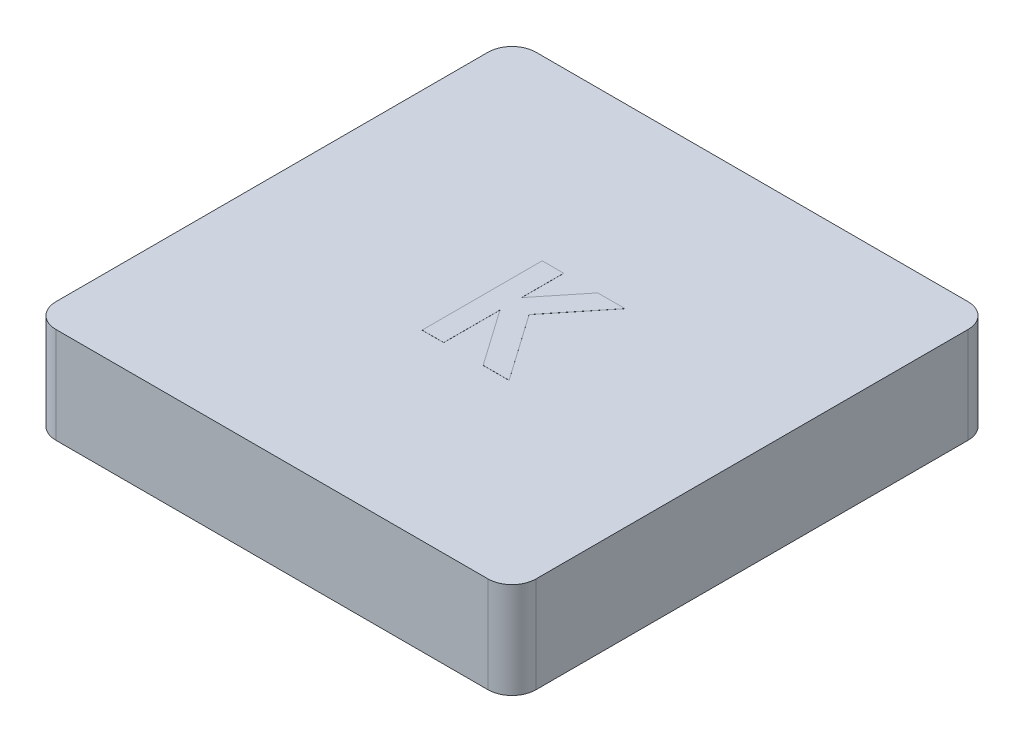
ISO-10303-21;
HEADER;
FILE_DESCRIPTION(('STEP AP214'),'2;1');
FILE_NAME('part.step','',(''),(''),'','','');
FILE_SCHEMA(('AUTOMOTIVE_DESIGN { 1 0 10303 214 1 1 1 1 }'));
ENDSEC;
DATA;
#1=APPLICATION_CONTEXT('core data for automotive mechanical design processes');
#2=APPLICATION_PROTOCOL_DEFINITION('international standard','automotive_design',2000,#1);
#3=PRODUCT_CONTEXT('',#1,'mechanical');
#4=PRODUCT('Part','Part','',(#3));
#5=PRODUCT_RELATED_PRODUCT_CATEGORY('part','',(#4));
#6=PRODUCT_DEFINITION_FORMATION('','',#4);
#7=PRODUCT_DEFINITION_CONTEXT('part definition',#1,'design');
#8=PRODUCT_DEFINITION('design','',#6,#7);
#9=PRODUCT_DEFINITION_SHAPE('','',#8);
#10=(LENGTH_UNIT() NAMED_UNIT(*) SI_UNIT(.MILLI.,.METRE.));
#11=(NAMED_UNIT(*) PLANE_ANGLE_UNIT() SI_UNIT($,.RADIAN.));
#12=(NAMED_UNIT(*) SI_UNIT($,.STERADIAN.) SOLID_ANGLE_UNIT());
#13=UNCERTAINTY_MEASURE_WITH_UNIT(LENGTH_MEASURE(1.E-05),#10,'distance_accuracy_value','');
#14=(GEOMETRIC_REPRESENTATION_CONTEXT(3) GLOBAL_UNCERTAINTY_ASSIGNED_CONTEXT((#13)) GLOBAL_UNIT_ASSIGNED_CONTEXT((#10,
#11,#12)) REPRESENTATION_CONTEXT('',''));
#15=CARTESIAN_POINT('',(0.,0.,0.));
#16=DIRECTION('',(0.,0.,1.));
#17=DIRECTION('',(1.,0.,0.));
#18=AXIS2_PLACEMENT_3D('',#15,#16,#17);
#19=CARTESIAN_POINT('',(0.,2.54,-12.7));
#20=DIRECTION('',(1.,0.,0.));
#21=DIRECTION('',(0.,0.,-1.));
#22=AXIS2_PLACEMENT_3D('',#19,#20,#21);
#23=PLANE('',#22);
#24=DIRECTION('',(0.,0.,1.));
#25=VECTOR('',#24,1.);
#26=CARTESIAN_POINT('',(0.,2.54,-12.7));
#27=LINE('',#26,#25);
#28=CARTESIAN_POINT('',(0.,2.54,-12.065));
#29=VERTEX_POINT('',#28);
#30=CARTESIAN_POINT('',(0.,2.54,-0.635));
#31=VERTEX_POINT('',#30);
#32=EDGE_CURVE('E322',#29,#31,#27,.T.);
#33=ORIENTED_EDGE('',*,*,#32,.F.);
#34=DIRECTION('',(0.,-1.,0.));
#35=VECTOR('',#34,1.);
#36=CARTESIAN_POINT('',(0.,2.54,-12.065));
#37=LINE('',#36,#35);
#38=CARTESIAN_POINT('',(0.,0.,-12.065));
#39=VERTEX_POINT('',#38);
#40=EDGE_CURVE('E347',#29,#39,#37,.T.);
#41=ORIENTED_EDGE('',*,*,#40,.T.);
#42=DIRECTION('',(0.,0.,1.));
#43=VECTOR('',#42,1.);
#44=CARTESIAN_POINT('',(0.,0.,-12.7));
#45=LINE('',#44,#43);
#46=CARTESIAN_POINT('',(0.,0.,-0.635));
#47=VERTEX_POINT('',#46);
#48=EDGE_CURVE('E302',#39,#47,#45,.T.);
#49=ORIENTED_EDGE('',*,*,#48,.T.);
#50=DIRECTION('',(0.,-1.,0.));
#51=VECTOR('',#50,1.);
#52=CARTESIAN_POINT('',(0.,2.54,-0.635));
#53=LINE('',#52,#51);
#54=EDGE_CURVE('E335',#47,#31,#53,.F.);
#55=ORIENTED_EDGE('',*,*,#54,.T.);
#56=EDGE_LOOP('',(#33,#41,#49,#55));
#57=FACE_BOUND('',#56,.T.);
#58=ADVANCED_FACE('F33',(#57),#23,.F.);
#59=CARTESIAN_POINT('',(0.,2.54,0.));
#60=DIRECTION('',(0.,0.,-1.));
#61=DIRECTION('',(-1.,0.,0.));
#62=AXIS2_PLACEMENT_3D('',#59,#60,#61);
#63=PLANE('',#62);
#64=DIRECTION('',(1.,0.,0.));
#65=VECTOR('',#64,1.);
#66=CARTESIAN_POINT('',(0.,0.,0.));
#67=LINE('',#66,#65);
#68=CARTESIAN_POINT('',(0.635,0.,0.));
#69=VERTEX_POINT('',#68);
#70=CARTESIAN_POINT('',(12.065,0.,0.));
#71=VERTEX_POINT('',#70);
#72=EDGE_CURVE('E338',#69,#71,#67,.T.);
#73=ORIENTED_EDGE('',*,*,#72,.T.);
#74=DIRECTION('',(0.,-1.,0.));
#75=VECTOR('',#74,1.);
#76=CARTESIAN_POINT('',(12.065,2.54,0.));
#77=LINE('',#76,#75);
#78=CARTESIAN_POINT('',(12.065,2.54,0.));
#79=VERTEX_POINT('',#78);
#80=EDGE_CURVE('E41',#71,#79,#77,.F.);
#81=ORIENTED_EDGE('',*,*,#80,.T.);
#82=DIRECTION('',(1.,0.,0.));
#83=VECTOR('',#82,1.);
#84=CARTESIAN_POINT('',(0.,2.54,0.));
#85=LINE('',#84,#83);
#86=CARTESIAN_POINT('',(0.635,2.54,0.));
#87=VERTEX_POINT('',#86);
#88=EDGE_CURVE('E325',#87,#79,#85,.T.);
#89=ORIENTED_EDGE('',*,*,#88,.F.);
#90=DIRECTION('',(0.,-1.,0.));
#91=VECTOR('',#90,1.);
#92=CARTESIAN_POINT('',(0.635,2.54,0.));
#93=LINE('',#92,#91);
#94=EDGE_CURVE('E376',#87,#69,#93,.T.);
#95=ORIENTED_EDGE('',*,*,#94,.T.);
#96=EDGE_LOOP('',(#73,#81,#89,#95));
#97=FACE_BOUND('',#96,.T.);
#98=ADVANCED_FACE('F381',(#97),#63,.F.);
#99=CARTESIAN_POINT('',(12.7,2.54,0.));
#100=DIRECTION('',(-1.,0.,0.));
#101=DIRECTION('',(0.,0.,1.));
#102=AXIS2_PLACEMENT_3D('',#99,#100,#101);
#103=PLANE('',#102);
#104=DIRECTION('',(0.,0.,-1.));
#105=VECTOR('',#104,1.);
#106=CARTESIAN_POINT('',(12.7,0.,0.));
#107=LINE('',#106,#105);
#108=CARTESIAN_POINT('',(12.7,0.,-0.635));
#109=VERTEX_POINT('',#108);
#110=CARTESIAN_POINT('',(12.7,0.,-12.065));
#111=VERTEX_POINT('',#110);
#112=EDGE_CURVE('E341',#109,#111,#107,.T.);
#113=ORIENTED_EDGE('',*,*,#112,.T.);
#114=DIRECTION('',(0.,-1.,0.));
#115=VECTOR('',#114,1.);
#116=CARTESIAN_POINT('',(12.7,2.54,-12.065));
#117=LINE('',#116,#115);
#118=CARTESIAN_POINT('',(12.7,2.54,-12.065));
#119=VERTEX_POINT('',#118);
#120=EDGE_CURVE('E374',#111,#119,#117,.F.);
#121=ORIENTED_EDGE('',*,*,#120,.T.);
#122=DIRECTION('',(0.,0.,-1.));
#123=VECTOR('',#122,1.);
#124=CARTESIAN_POINT('',(12.7,2.54,0.));
#125=LINE('',#124,#123);
#126=CARTESIAN_POINT('',(12.7,2.54,-0.635));
#127=VERTEX_POINT('',#126);
#128=EDGE_CURVE('E329',#127,#119,#125,.T.);
#129=ORIENTED_EDGE('',*,*,#128,.F.);
#130=DIRECTION('',(0.,-1.,0.));
#131=VECTOR('',#130,1.);
#132=CARTESIAN_POINT('',(12.7,2.54,-0.635));
#133=LINE('',#132,#131);
#134=EDGE_CURVE('E371',#127,#109,#133,.T.);
#135=ORIENTED_EDGE('',*,*,#134,.T.);
#136=EDGE_LOOP('',(#113,#121,#129,#135));
#137=FACE_BOUND('',#136,.T.);
#138=ADVANCED_FACE('F394',(#137),#103,.F.);
#139=CARTESIAN_POINT('',(12.7,2.54,-12.7));
#140=DIRECTION('',(0.,0.,1.));
#141=DIRECTION('',(1.,0.,0.));
#142=AXIS2_PLACEMENT_3D('',#139,#140,#141);
#143=PLANE('',#142);
#144=DIRECTION('',(-1.,0.,0.));
#145=VECTOR('',#144,1.);
#146=CARTESIAN_POINT('',(12.7,0.,-12.7));
#147=LINE('',#146,#145);
#148=CARTESIAN_POINT('',(12.065,0.,-12.7));
#149=VERTEX_POINT('',#148);
#150=CARTESIAN_POINT('',(0.634999999999995,0.,-12.7));
#151=VERTEX_POINT('',#150);
#152=EDGE_CURVE('E326',#149,#151,#147,.T.);
#153=ORIENTED_EDGE('',*,*,#152,.T.);
#154=DIRECTION('',(0.,-1.,0.));
#155=VECTOR('',#154,1.);
#156=CARTESIAN_POINT('',(0.634999999999995,2.54,-12.7));
#157=LINE('',#156,#155);
#158=CARTESIAN_POINT('',(0.634999999999995,2.54,-12.7));
#159=VERTEX_POINT('',#158);
#160=EDGE_CURVE('E361',#151,#159,#157,.F.);
#161=ORIENTED_EDGE('',*,*,#160,.T.);
#162=DIRECTION('',(-1.,0.,0.));
#163=VECTOR('',#162,1.);
#164=CARTESIAN_POINT('',(12.7,2.54,-12.7));
#165=LINE('',#164,#163);
#166=CARTESIAN_POINT('',(12.065,2.54,-12.7));
#167=VERTEX_POINT('',#166);
#168=EDGE_CURVE('E332',#167,#159,#165,.T.);
#169=ORIENTED_EDGE('',*,*,#168,.F.);
#170=DIRECTION('',(0.,-1.,0.));
#171=VECTOR('',#170,1.);
#172=CARTESIAN_POINT('',(12.065,2.54,-12.7));
#173=LINE('',#172,#171);
#174=EDGE_CURVE('E358',#167,#149,#173,.T.);
#175=ORIENTED_EDGE('',*,*,#174,.T.);
#176=EDGE_LOOP('',(#153,#161,#169,#175));
#177=FACE_BOUND('',#176,.T.);
#178=ADVANCED_FACE('F406',(#177),#143,.F.);
#179=CARTESIAN_POINT('',(0.,2.54,0.));
#180=DIRECTION('',(0.,1.,0.));
#181=DIRECTION('',(0.,0.,1.));
#182=AXIS2_PLACEMENT_3D('',#179,#180,#181);
#183=PLANE('',#182);
#184=DIRECTION('',(0.,0.,-1.));
#185=VECTOR('',#184,1.);
#186=CARTESIAN_POINT('',(5.49714615384615,2.54,-4.826));
#187=LINE('',#186,#185);
#188=CARTESIAN_POINT('',(5.49714615384615,2.54,-4.826));
#189=VERTEX_POINT('',#188);
#190=CARTESIAN_POINT('',(5.49714615384615,2.54,-8.001));
#191=VERTEX_POINT('',#190);
#192=EDGE_CURVE('E239',#189,#191,#187,.T.);
#193=ORIENTED_EDGE('',*,*,#192,.T.);
#194=DIRECTION('',(1.,0.,0.));
#195=VECTOR('',#194,1.);
#196=CARTESIAN_POINT('',(5.49714615384615,2.54,-8.001));
#197=LINE('',#196,#195);
#198=CARTESIAN_POINT('',(6.06701794871794,2.54,-8.001));
#199=VERTEX_POINT('',#198);
#200=EDGE_CURVE('E193',#191,#199,#197,.T.);
#201=ORIENTED_EDGE('',*,*,#200,.T.);
#202=DIRECTION('',(0.,0.,1.));
#203=VECTOR('',#202,1.);
#204=CARTESIAN_POINT('',(6.06701794871794,2.54,-8.001));
#205=LINE('',#204,#203);
#206=CARTESIAN_POINT('',(6.06701794871794,2.54,-6.88351702724359));
#207=VERTEX_POINT('',#206);
#208=EDGE_CURVE('E242',#199,#207,#205,.T.);
#209=ORIENTED_EDGE('',*,*,#208,.T.);
#210=DIRECTION('',(0.627501225330358,0.,-0.778615574085761));
#211=VECTOR('',#210,1.);
#212=CARTESIAN_POINT('',(6.06701794871794,2.54,-6.88351702724359));
#213=LINE('',#212,#211);
#214=CARTESIAN_POINT('',(6.9676189102564,2.54,-8.001));
#215=VERTEX_POINT('',#214);
#216=EDGE_CURVE('E244',#207,#215,#213,.T.);
#217=ORIENTED_EDGE('',*,*,#216,.T.);
#218=DIRECTION('',(1.,0.,0.));
#219=VECTOR('',#218,1.);
#220=CARTESIAN_POINT('',(6.96761891025641,2.54,-8.001));
#221=LINE('',#220,#219);
#222=CARTESIAN_POINT('',(7.68695484775641,2.54,-8.001));
#223=VERTEX_POINT('',#222);
#224=EDGE_CURVE('E246',#215,#223,#221,.T.);
#225=ORIENTED_EDGE('',*,*,#224,.T.);
#226=DIRECTION('',(-0.627400828485831,0.,0.778696475152734));
#227=VECTOR('',#226,1.);
#228=CARTESIAN_POINT('',(7.68695484775641,2.54,-8.001));
#229=LINE('',#228,#227);
#230=CARTESIAN_POINT('',(6.55547948717948,2.54,-6.59667307692308));
#231=VERTEX_POINT('',#230);
#232=EDGE_CURVE('E248',#223,#231,#229,.T.);
#233=ORIENTED_EDGE('',*,*,#232,.T.);
#234=DIRECTION('',(0.574093809748457,0.,0.818789531936323));
#235=VECTOR('',#234,1.);
#236=CARTESIAN_POINT('',(6.55547948717948,2.54,-6.59667307692308));
#237=LINE('',#236,#235);
#238=CARTESIAN_POINT('',(7.79698589743589,2.54,-4.826));
#239=VERTEX_POINT('',#238);
#240=EDGE_CURVE('E250',#231,#239,#237,.T.);
#241=ORIENTED_EDGE('',*,*,#240,.T.);
#242=DIRECTION('',(-1.,0.,0.));
#243=VECTOR('',#242,1.);
#244=CARTESIAN_POINT('',(7.79698589743589,2.54,-4.826));
#245=LINE('',#244,#243);
#246=CARTESIAN_POINT('',(7.11072287660256,2.54,-4.826));
#247=VERTEX_POINT('',#246);
#248=EDGE_CURVE('E252',#239,#247,#245,.T.);
#249=ORIENTED_EDGE('',*,*,#248,.T.);
#250=DIRECTION('',(-0.574002161068284,0.,-0.818853783705577));
#251=VECTOR('',#250,1.);
#252=CARTESIAN_POINT('',(7.11072287660256,2.54,-4.826));
#253=LINE('',#252,#251);
#254=CARTESIAN_POINT('',(6.06701794871794,2.54,-6.31491726762821));
#255=VERTEX_POINT('',#254);
#256=EDGE_CURVE('E254',#247,#255,#253,.T.);
#257=ORIENTED_EDGE('',*,*,#256,.T.);
#258=DIRECTION('',(0.,0.,1.));
#259=VECTOR('',#258,1.);
#260=CARTESIAN_POINT('',(6.06701794871794,2.54,-6.31491726762821));
#261=LINE('',#260,#259);
#262=CARTESIAN_POINT('',(6.06701794871794,2.54,-4.826));
#263=VERTEX_POINT('',#262);
#264=EDGE_CURVE('E53',#255,#263,#261,.T.);
#265=ORIENTED_EDGE('',*,*,#264,.T.);
#266=DIRECTION('',(-1.,0.,0.));
#267=VECTOR('',#266,1.);
#268=CARTESIAN_POINT('',(6.06701794871794,2.54,-4.826));
#269=LINE('',#268,#267);
#270=EDGE_CURVE('E48',#263,#189,#269,.T.);
#271=ORIENTED_EDGE('',*,*,#270,.T.);
#272=EDGE_LOOP('',(#193,#201,#209,#217,#225,#233,#241,#249,#257,#265,#271));
#273=FACE_BOUND('',#272,.T.);
#274=ORIENTED_EDGE('',*,*,#168,.T.);
#275=CARTESIAN_POINT('',(0.634999999999995,2.54,-12.065));
#276=DIRECTION('',(0.,1.,0.));
#277=DIRECTION('',(0.,0.,1.));
#278=AXIS2_PLACEMENT_3D('',#275,#276,#277);
#279=CIRCLE('',#278,0.635);
#280=EDGE_CURVE('E369',#159,#29,#279,.T.);
#281=ORIENTED_EDGE('',*,*,#280,.T.);
#282=ORIENTED_EDGE('',*,*,#32,.T.);
#283=CARTESIAN_POINT('',(0.635,2.54,-0.635));
#284=DIRECTION('',(0.,1.,0.));
#285=DIRECTION('',(0.,0.,1.));
#286=AXIS2_PLACEMENT_3D('',#283,#284,#285);
#287=CIRCLE('',#286,0.635);
#288=EDGE_CURVE('E363',#31,#87,#287,.T.);
#289=ORIENTED_EDGE('',*,*,#288,.T.);
#290=ORIENTED_EDGE('',*,*,#88,.T.);
#291=CARTESIAN_POINT('',(12.065,2.54,-0.635));
#292=DIRECTION('',(0.,1.,0.));
#293=DIRECTION('',(0.,0.,1.));
#294=AXIS2_PLACEMENT_3D('',#291,#292,#293);
#295=CIRCLE('',#294,0.635);
#296=EDGE_CURVE('E365',#79,#127,#295,.T.);
#297=ORIENTED_EDGE('',*,*,#296,.T.);
#298=ORIENTED_EDGE('',*,*,#128,.T.);
#299=CARTESIAN_POINT('',(12.065,2.54,-12.065));
#300=DIRECTION('',(0.,1.,0.));
#301=DIRECTION('',(0.,0.,1.));
#302=AXIS2_PLACEMENT_3D('',#299,#300,#301);
#303=CIRCLE('',#302,0.635);
#304=EDGE_CURVE('E367',#119,#167,#303,.T.);
#305=ORIENTED_EDGE('',*,*,#304,.T.);
#306=EDGE_LOOP('',(#274,#281,#282,#289,#290,#297,#298,#305));
#307=FACE_BOUND('',#306,.T.);
#308=ADVANCED_FACE('F387',(#273,#307),#183,.T.);
#309=CARTESIAN_POINT('',(0.,0.,0.));
#310=DIRECTION('',(0.,1.,0.));
#311=DIRECTION('',(0.,0.,1.));
#312=AXIS2_PLACEMENT_3D('',#309,#310,#311);
#313=PLANE('',#312);
#314=DIRECTION('',(-1.,0.,0.));
#315=VECTOR('',#314,1.);
#316=CARTESIAN_POINT('',(12.7,0.,-12.065));
#317=LINE('',#316,#315);
#318=CARTESIAN_POINT('',(12.065,0.,-12.065));
#319=VERTEX_POINT('',#318);
#320=CARTESIAN_POINT('',(0.634999999999995,0.,-12.065));
#321=VERTEX_POINT('',#320);
#322=EDGE_CURVE('E290',#319,#321,#317,.T.);
#323=ORIENTED_EDGE('',*,*,#322,.T.);
#324=DIRECTION('',(0.,0.,1.));
#325=VECTOR('',#324,1.);
#326=CARTESIAN_POINT('',(0.634999999999995,0.,-12.7));
#327=LINE('',#326,#325);
#328=CARTESIAN_POINT('',(0.635,0.,-0.635));
#329=VERTEX_POINT('',#328);
#330=EDGE_CURVE('E285',#321,#329,#327,.T.);
#331=ORIENTED_EDGE('',*,*,#330,.T.);
#332=DIRECTION('',(1.,0.,0.));
#333=VECTOR('',#332,1.);
#334=CARTESIAN_POINT('',(0.,0.,-0.635));
#335=LINE('',#334,#333);
#336=CARTESIAN_POINT('',(12.065,0.,-0.635));
#337=VERTEX_POINT('',#336);
#338=EDGE_CURVE('E314',#329,#337,#335,.T.);
#339=ORIENTED_EDGE('',*,*,#338,.T.);
#340=DIRECTION('',(0.,0.,-1.));
#341=VECTOR('',#340,1.);
#342=CARTESIAN_POINT('',(12.065,0.,0.));
#343=LINE('',#342,#341);
#344=EDGE_CURVE('E317',#337,#319,#343,.T.);
#345=ORIENTED_EDGE('',*,*,#344,.T.);
#346=EDGE_LOOP('',(#323,#331,#339,#345));
#347=FACE_BOUND('',#346,.T.);
#348=ORIENTED_EDGE('',*,*,#48,.F.);
#349=CARTESIAN_POINT('',(0.634999999999995,0.,-12.065));
#350=DIRECTION('',(0.,1.,0.));
#351=DIRECTION('',(0.,0.,1.));
#352=AXIS2_PLACEMENT_3D('',#349,#350,#351);
#353=CIRCLE('',#352,0.635);
#354=EDGE_CURVE('E356',#39,#151,#353,.F.);
#355=ORIENTED_EDGE('',*,*,#354,.T.);
#356=ORIENTED_EDGE('',*,*,#152,.F.);
#357=CARTESIAN_POINT('',(12.065,0.,-12.065));
#358=DIRECTION('',(0.,1.,0.));
#359=DIRECTION('',(0.,0.,1.));
#360=AXIS2_PLACEMENT_3D('',#357,#358,#359);
#361=CIRCLE('',#360,0.635);
#362=EDGE_CURVE('E354',#149,#111,#361,.F.);
#363=ORIENTED_EDGE('',*,*,#362,.T.);
#364=ORIENTED_EDGE('',*,*,#112,.F.);
#365=CARTESIAN_POINT('',(12.065,0.,-0.635));
#366=DIRECTION('',(0.,1.,0.));
#367=DIRECTION('',(0.,0.,1.));
#368=AXIS2_PLACEMENT_3D('',#365,#366,#367);
#369=CIRCLE('',#368,0.635);
#370=EDGE_CURVE('E352',#109,#71,#369,.F.);
#371=ORIENTED_EDGE('',*,*,#370,.T.);
#372=ORIENTED_EDGE('',*,*,#72,.F.);
#373=CARTESIAN_POINT('',(0.635,0.,-0.635));
#374=DIRECTION('',(0.,1.,0.));
#375=DIRECTION('',(0.,0.,1.));
#376=AXIS2_PLACEMENT_3D('',#373,#374,#375);
#377=CIRCLE('',#376,0.635);
#378=EDGE_CURVE('E350',#69,#47,#377,.F.);
#379=ORIENTED_EDGE('',*,*,#378,.T.);
#380=EDGE_LOOP('',(#348,#355,#356,#363,#364,#371,#372,#379));
#381=FACE_BOUND('',#380,.T.);
#382=ADVANCED_FACE('F398',(#347,#381),#313,.F.);
#383=CARTESIAN_POINT('',(0.634999999999995,2.54,-12.065));
#384=DIRECTION('',(0.,-1.,0.));
#385=DIRECTION('',(0.,0.,-1.));
#386=AXIS2_PLACEMENT_3D('',#383,#384,#385);
#387=CYLINDRICAL_SURFACE('',#386,0.635);
#388=ORIENTED_EDGE('',*,*,#280,.F.);
#389=ORIENTED_EDGE('',*,*,#160,.F.);
#390=ORIENTED_EDGE('',*,*,#354,.F.);
#391=ORIENTED_EDGE('',*,*,#40,.F.);
#392=EDGE_LOOP('',(#388,#389,#390,#391));
#393=FACE_BOUND('',#392,.T.);
#394=ADVANCED_FACE('F412',(#393),#387,.T.);
#395=CARTESIAN_POINT('',(12.065,2.54,-12.065));
#396=DIRECTION('',(0.,-1.,0.));
#397=DIRECTION('',(0.,0.,-1.));
#398=AXIS2_PLACEMENT_3D('',#395,#396,#397);
#399=CYLINDRICAL_SURFACE('',#398,0.635);
#400=ORIENTED_EDGE('',*,*,#304,.F.);
#401=ORIENTED_EDGE('',*,*,#120,.F.);
#402=ORIENTED_EDGE('',*,*,#362,.F.);
#403=ORIENTED_EDGE('',*,*,#174,.F.);
#404=EDGE_LOOP('',(#400,#401,#402,#403));
#405=FACE_BOUND('',#404,.T.);
#406=ADVANCED_FACE('F403',(#405),#399,.T.);
#407=CARTESIAN_POINT('',(12.065,2.54,-0.635));
#408=DIRECTION('',(0.,-1.,0.));
#409=DIRECTION('',(0.,0.,-1.));
#410=AXIS2_PLACEMENT_3D('',#407,#408,#409);
#411=CYLINDRICAL_SURFACE('',#410,0.635);
#412=ORIENTED_EDGE('',*,*,#296,.F.);
#413=ORIENTED_EDGE('',*,*,#80,.F.);
#414=ORIENTED_EDGE('',*,*,#370,.F.);
#415=ORIENTED_EDGE('',*,*,#134,.F.);
#416=EDGE_LOOP('',(#412,#413,#414,#415));
#417=FACE_BOUND('',#416,.T.);
#418=ADVANCED_FACE('F391',(#417),#411,.T.);
#419=CARTESIAN_POINT('',(0.635,2.54,-0.635));
#420=DIRECTION('',(0.,-1.,0.));
#421=DIRECTION('',(0.,0.,-1.));
#422=AXIS2_PLACEMENT_3D('',#419,#420,#421);
#423=CYLINDRICAL_SURFACE('',#422,0.635);
#424=ORIENTED_EDGE('',*,*,#288,.F.);
#425=ORIENTED_EDGE('',*,*,#54,.F.);
#426=ORIENTED_EDGE('',*,*,#378,.F.);
#427=ORIENTED_EDGE('',*,*,#94,.F.);
#428=EDGE_LOOP('',(#424,#425,#426,#427));
#429=FACE_BOUND('',#428,.T.);
#430=ADVANCED_FACE('F35',(#429),#423,.T.);
#431=CARTESIAN_POINT('',(0.634999999999995,2.54,-12.7));
#432=DIRECTION('',(1.,0.,0.));
#433=DIRECTION('',(0.,0.,-1.));
#434=AXIS2_PLACEMENT_3D('',#431,#432,#433);
#435=PLANE('',#434);
#436=DIRECTION('',(0.,0.,1.));
#437=VECTOR('',#436,1.);
#438=CARTESIAN_POINT('',(0.634999999999995,1.905,-12.7));
#439=LINE('',#438,#437);
#440=CARTESIAN_POINT('',(0.634999999999995,1.905,-12.065));
#441=VERTEX_POINT('',#440);
#442=CARTESIAN_POINT('',(0.635,1.905,-0.635));
#443=VERTEX_POINT('',#442);
#444=EDGE_CURVE('E286',#441,#443,#439,.T.);
#445=ORIENTED_EDGE('',*,*,#444,.T.);
#446=DIRECTION('',(0.,1.,0.));
#447=VECTOR('',#446,1.);
#448=CARTESIAN_POINT('',(0.635,2.54,-0.635));
#449=LINE('',#448,#447);
#450=EDGE_CURVE('E295',#329,#443,#449,.T.);
#451=ORIENTED_EDGE('',*,*,#450,.F.);
#452=ORIENTED_EDGE('',*,*,#330,.F.);
#453=DIRECTION('',(0.,1.,0.));
#454=VECTOR('',#453,1.);
#455=CARTESIAN_POINT('',(0.634999999999995,2.54,-12.065));
#456=LINE('',#455,#454);
#457=EDGE_CURVE('E291',#321,#441,#456,.T.);
#458=ORIENTED_EDGE('',*,*,#457,.T.);
#459=EDGE_LOOP('',(#445,#451,#452,#458));
#460=FACE_BOUND('',#459,.T.);
#461=ADVANCED_FACE('F417',(#460),#435,.T.);
#462=CARTESIAN_POINT('',(0.,2.54,-0.635));
#463=DIRECTION('',(0.,0.,-1.));
#464=DIRECTION('',(-1.,0.,0.));
#465=AXIS2_PLACEMENT_3D('',#462,#463,#464);
#466=PLANE('',#465);
#467=ORIENTED_EDGE('',*,*,#338,.F.);
#468=ORIENTED_EDGE('',*,*,#450,.T.);
#469=DIRECTION('',(1.,0.,0.));
#470=VECTOR('',#469,1.);
#471=CARTESIAN_POINT('',(0.,1.905,-0.635));
#472=LINE('',#471,#470);
#473=CARTESIAN_POINT('',(12.065,1.905,-0.635));
#474=VERTEX_POINT('',#473);
#475=EDGE_CURVE('E289',#443,#474,#472,.T.);
#476=ORIENTED_EDGE('',*,*,#475,.T.);
#477=DIRECTION('',(0.,1.,0.));
#478=VECTOR('',#477,1.);
#479=CARTESIAN_POINT('',(12.065,2.54,-0.635));
#480=LINE('',#479,#478);
#481=EDGE_CURVE('E299',#337,#474,#480,.T.);
#482=ORIENTED_EDGE('',*,*,#481,.F.);
#483=EDGE_LOOP('',(#467,#468,#476,#482));
#484=FACE_BOUND('',#483,.T.);
#485=ADVANCED_FACE('F422',(#484),#466,.T.);
#486=CARTESIAN_POINT('',(12.065,2.54,0.));
#487=DIRECTION('',(-1.,0.,0.));
#488=DIRECTION('',(0.,0.,1.));
#489=AXIS2_PLACEMENT_3D('',#486,#487,#488);
#490=PLANE('',#489);
#491=ORIENTED_EDGE('',*,*,#344,.F.);
#492=ORIENTED_EDGE('',*,*,#481,.T.);
#493=DIRECTION('',(0.,0.,-1.));
#494=VECTOR('',#493,1.);
#495=CARTESIAN_POINT('',(12.065,1.905,0.));
#496=LINE('',#495,#494);
#497=CARTESIAN_POINT('',(12.065,1.905,-12.065));
#498=VERTEX_POINT('',#497);
#499=EDGE_CURVE('E305',#474,#498,#496,.T.);
#500=ORIENTED_EDGE('',*,*,#499,.T.);
#501=DIRECTION('',(0.,1.,0.));
#502=VECTOR('',#501,1.);
#503=CARTESIAN_POINT('',(12.065,2.54,-12.065));
#504=LINE('',#503,#502);
#505=EDGE_CURVE('E294',#319,#498,#504,.T.);
#506=ORIENTED_EDGE('',*,*,#505,.F.);
#507=EDGE_LOOP('',(#491,#492,#500,#506));
#508=FACE_BOUND('',#507,.T.);
#509=ADVANCED_FACE('F475',(#508),#490,.T.);
#510=CARTESIAN_POINT('',(12.7,2.54,-12.065));
#511=DIRECTION('',(0.,0.,1.));
#512=DIRECTION('',(1.,0.,0.));
#513=AXIS2_PLACEMENT_3D('',#510,#511,#512);
#514=PLANE('',#513);
#515=ORIENTED_EDGE('',*,*,#322,.F.);
#516=ORIENTED_EDGE('',*,*,#505,.T.);
#517=DIRECTION('',(-1.,0.,0.));
#518=VECTOR('',#517,1.);
#519=CARTESIAN_POINT('',(12.7,1.905,-12.065));
#520=LINE('',#519,#518);
#521=EDGE_CURVE('E298',#498,#441,#520,.T.);
#522=ORIENTED_EDGE('',*,*,#521,.T.);
#523=ORIENTED_EDGE('',*,*,#457,.F.);
#524=EDGE_LOOP('',(#515,#516,#522,#523));
#525=FACE_BOUND('',#524,.T.);
#526=ADVANCED_FACE('F485',(#525),#514,.T.);
#527=CARTESIAN_POINT('',(0.,1.905,0.));
#528=DIRECTION('',(0.,1.,0.));
#529=DIRECTION('',(0.,0.,1.));
#530=AXIS2_PLACEMENT_3D('',#527,#528,#529);
#531=PLANE('',#530);
#532=CARTESIAN_POINT('',(6.34999999999999,1.905,-6.35));
#533=DIRECTION('',(0.,1.,0.));
#534=DIRECTION('',(0.,0.,1.));
#535=AXIS2_PLACEMENT_3D('',#532,#533,#534);
#536=CIRCLE('',#535,2.54);
#537=CARTESIAN_POINT('',(6.34999999999999,1.905,-3.81));
#538=VERTEX_POINT('',#537);
#539=EDGE_CURVE('E11',#538,#538,#536,.F.);
#540=ORIENTED_EDGE('',*,*,#539,.F.);
#541=EDGE_LOOP('',(#540));
#542=FACE_BOUND('',#541,.T.);
#543=ORIENTED_EDGE('',*,*,#521,.F.);
#544=ORIENTED_EDGE('',*,*,#499,.F.);
#545=ORIENTED_EDGE('',*,*,#475,.F.);
#546=ORIENTED_EDGE('',*,*,#444,.F.);
#547=EDGE_LOOP('',(#543,#544,#545,#546));
#548=FACE_BOUND('',#547,.T.);
#549=ADVANCED_FACE('F495',(#542,#548),#531,.F.);
#550=CARTESIAN_POINT('',(6.34999999999999,-7.18420489685532,-6.35));
#551=DIRECTION('',(0.,1.,0.));
#552=DIRECTION('',(0.,0.,1.));
#553=AXIS2_PLACEMENT_3D('',#550,#551,#552);
#554=CYLINDRICAL_SURFACE('',#553,2.54);
#555=CARTESIAN_POINT('',(6.34999999999999,0.,-6.35));
#556=DIRECTION('',(0.,1.,0.));
#557=DIRECTION('',(0.,0.,1.));
#558=AXIS2_PLACEMENT_3D('',#555,#556,#557);
#559=CIRCLE('',#558,2.54);
#560=CARTESIAN_POINT('',(6.34999999999999,0.,-3.81));
#561=VERTEX_POINT('',#560);
#562=EDGE_CURVE('E258',#561,#561,#559,.T.);
#563=CARTESIAN_POINT('',(6.34999999999999,0.,-3.81));
#564=CARTESIAN_POINT('',(6.34999999999999,0.0198437499999991,-3.81));
#565=CARTESIAN_POINT('',(6.34999999999999,0.0396874999999989,-3.81));
#566=CARTESIAN_POINT('',(6.34999999999999,0.079374999999999,-3.81));
#567=CARTESIAN_POINT('',(6.34999999999999,0.0992187499999992,-3.81));
#568=CARTESIAN_POINT('',(6.34999999999999,0.138906249999999,-3.81));
#569=CARTESIAN_POINT('',(6.34999999999999,0.158749999999999,-3.81));
#570=CARTESIAN_POINT('',(6.34999999999999,0.198437499999999,-3.81));
#571=CARTESIAN_POINT('',(6.34999999999999,0.218281249999999,-3.81));
#572=CARTESIAN_POINT('',(6.34999999999999,0.25796875,-3.81));
#573=CARTESIAN_POINT('',(6.34999999999999,0.277812499999999,-3.81));
#574=CARTESIAN_POINT('',(6.34999999999999,0.317499999999999,-3.81));
#575=CARTESIAN_POINT('',(6.34999999999999,0.337343749999999,-3.81));
#576=CARTESIAN_POINT('',(6.34999999999999,0.377031249999999,-3.81));
#577=CARTESIAN_POINT('',(6.34999999999999,0.396874999999999,-3.81));
#578=CARTESIAN_POINT('',(6.34999999999999,0.436562499999999,-3.81));
#579=CARTESIAN_POINT('',(6.34999999999999,0.456406249999999,-3.81));
#580=CARTESIAN_POINT('',(6.34999999999999,0.496093749999999,-3.81));
#581=CARTESIAN_POINT('',(6.34999999999999,0.515937499999999,-3.81));
#582=CARTESIAN_POINT('',(6.34999999999999,0.555624999999999,-3.81));
#583=CARTESIAN_POINT('',(6.34999999999999,0.575468749999999,-3.81));
#584=CARTESIAN_POINT('',(6.34999999999999,0.615156249999999,-3.81));
#585=CARTESIAN_POINT('',(6.34999999999999,0.634999999999999,-3.81));
#586=CARTESIAN_POINT('',(6.34999999999999,0.674687499999998,-3.81));
#587=CARTESIAN_POINT('',(6.34999999999999,0.694531249999998,-3.81));
#588=CARTESIAN_POINT('',(6.34999999999999,0.734218749999998,-3.81));
#589=CARTESIAN_POINT('',(6.34999999999999,0.754062499999998,-3.81));
#590=CARTESIAN_POINT('',(6.34999999999999,0.793749999999998,-3.81));
#591=CARTESIAN_POINT('',(6.34999999999999,0.813593749999999,-3.81));
#592=CARTESIAN_POINT('',(6.34999999999999,0.853281249999999,-3.81));
#593=CARTESIAN_POINT('',(6.34999999999999,0.873124999999999,-3.81));
#594=CARTESIAN_POINT('',(6.34999999999999,0.912812499999999,-3.81));
#595=CARTESIAN_POINT('',(6.34999999999999,0.932656249999999,-3.81));
#596=CARTESIAN_POINT('',(6.34999999999999,0.972343749999998,-3.81));
#597=CARTESIAN_POINT('',(6.34999999999999,0.992187499999998,-3.81));
#598=CARTESIAN_POINT('',(6.34999999999999,1.031875,-3.81));
#599=CARTESIAN_POINT('',(6.34999999999999,1.05171875,-3.81));
#600=CARTESIAN_POINT('',(6.34999999999999,1.09140625,-3.81));
#601=CARTESIAN_POINT('',(6.34999999999999,1.11125,-3.81));
#602=CARTESIAN_POINT('',(6.34999999999999,1.1509375,-3.81));
#603=CARTESIAN_POINT('',(6.34999999999999,1.17078125,-3.81));
#604=CARTESIAN_POINT('',(6.34999999999999,1.21046875,-3.81));
#605=CARTESIAN_POINT('',(6.34999999999999,1.2303125,-3.81));
#606=CARTESIAN_POINT('',(6.34999999999999,1.27,-3.81));
#607=CARTESIAN_POINT('',(6.34999999999999,1.28984375,-3.81));
#608=CARTESIAN_POINT('',(6.34999999999999,1.32953125,-3.81));
#609=CARTESIAN_POINT('',(6.34999999999999,1.349375,-3.81));
#610=CARTESIAN_POINT('',(6.34999999999999,1.3890625,-3.81));
#611=CARTESIAN_POINT('',(6.34999999999999,1.40890625,-3.81));
#612=CARTESIAN_POINT('',(6.34999999999999,1.44859375,-3.81));
#613=CARTESIAN_POINT('',(6.34999999999999,1.4684375,-3.81));
#614=CARTESIAN_POINT('',(6.34999999999999,1.508125,-3.81));
#615=CARTESIAN_POINT('',(6.34999999999999,1.52796875,-3.81));
#616=CARTESIAN_POINT('',(6.34999999999999,1.56765625,-3.81));
#617=CARTESIAN_POINT('',(6.34999999999999,1.5875,-3.81));
#618=CARTESIAN_POINT('',(6.34999999999999,1.6271875,-3.81));
#619=CARTESIAN_POINT('',(6.34999999999999,1.64703125,-3.81));
#620=CARTESIAN_POINT('',(6.34999999999999,1.68671875,-3.81));
#621=CARTESIAN_POINT('',(6.34999999999999,1.7065625,-3.81));
#622=CARTESIAN_POINT('',(6.34999999999999,1.74625,-3.81));
#623=CARTESIAN_POINT('',(6.34999999999999,1.76609375,-3.81));
#624=CARTESIAN_POINT('',(6.34999999999999,1.80578125,-3.81));
#625=CARTESIAN_POINT('',(6.34999999999999,1.825625,-3.81));
#626=CARTESIAN_POINT('',(6.34999999999999,1.8653125,-3.81));
#627=CARTESIAN_POINT('',(6.34999999999999,1.88515625,-3.81));
#628=CARTESIAN_POINT('',(6.34999999999999,1.905,-3.81));
#629=B_SPLINE_CURVE_WITH_KNOTS('',3,(#563,#564,#565,#566,#567,#568,#569,#570,#571,#572,#573,
#574,#575,#576,#577,#578,#579,#580,#581,#582,#583,#584,#585,#586,#587,#588,#589,#590,#591,#592,
#593,#594,#595,#596,#597,#598,#599,#600,#601,#602,#603,#604,#605,#606,#607,#608,#609,#610,#611,
#612,#613,#614,#615,#616,#617,#618,#619,#620,#621,#622,#623,#624,#625,#626,#627,#628),
.UNSPECIFIED.,.F.,.F.,(4,2,2,2,2,2,2,2,2,2,2,2,2,2,2,2,2,2,2,2,2,2,2,2,2,2,2,2,2,2,2,2,4),(0.,
0.0595312499999997,0.1190625,0.17859375,0.238125,0.29765625,0.3571875,0.41671875,0.47625,
0.53578125,0.5953125,0.654843749999999,0.714374999999999,0.773906249999999,0.8334375,0.89296875,
0.952499999999999,1.01203125,1.0715625,1.13109375,1.190625,1.25015625,1.3096875,1.36921875,
1.42875,1.48828125,1.5478125,1.60734375,1.666875,1.72640625,1.7859375,1.84546875,1.905),.UNSPECIFIED.);
#630=EDGE_CURVE('BSEAM505',#561,#538,#629,.T.);
#631=ORIENTED_EDGE('',*,*,#562,.T.);
#632=ORIENTED_EDGE('',*,*,#539,.T.);
#633=ORIENTED_EDGE('',*,*,#630,.T.);
#634=ORIENTED_EDGE('',*,*,#630,.F.);
#635=EDGE_LOOP('',(#631,#633,#632,#634));
#636=FACE_BOUND('',#635,.T.);
#637=ADVANCED_FACE('F505',(#636),#554,.T.);
#638=CARTESIAN_POINT('',(0.,0.,0.));
#639=DIRECTION('',(0.,1.,0.));
#640=DIRECTION('',(0.,0.,1.));
#641=AXIS2_PLACEMENT_3D('',#638,#639,#640);
#642=PLANE('',#641);
#643=ORIENTED_EDGE('',*,*,#562,.F.);
#644=EDGE_LOOP('',(#643));
#645=FACE_BOUND('',#644,.T.);
#646=ADVANCED_FACE('F515',(#645),#642,.F.);
#647=CARTESIAN_POINT('',(5.49714615384615,2.54254,-4.826));
#648=DIRECTION('',(-1.,0.,0.));
#649=DIRECTION('',(0.,0.,1.));
#650=AXIS2_PLACEMENT_3D('',#647,#648,#649);
#651=PLANE('',#650);
#652=ORIENTED_EDGE('',*,*,#192,.F.);
#653=DIRECTION('',(0.,-1.,0.));
#654=VECTOR('',#653,1.);
#655=CARTESIAN_POINT('',(5.49714615384615,2.54254,-4.826));
#656=LINE('',#655,#654);
#657=CARTESIAN_POINT('',(5.49714615384615,2.54254,-4.826));
#658=VERTEX_POINT('',#657);
#659=EDGE_CURVE('E212',#658,#189,#656,.T.);
#660=ORIENTED_EDGE('',*,*,#659,.F.);
#661=DIRECTION('',(0.,0.,-1.));
#662=VECTOR('',#661,1.);
#663=CARTESIAN_POINT('',(5.49714615384615,2.54254,-4.826));
#664=LINE('',#663,#662);
#665=CARTESIAN_POINT('',(5.49714615384615,2.54254,-8.001));
#666=VERTEX_POINT('',#665);
#667=EDGE_CURVE('E205',#658,#666,#664,.T.);
#668=ORIENTED_EDGE('',*,*,#667,.T.);
#669=DIRECTION('',(0.,-1.,0.));
#670=VECTOR('',#669,1.);
#671=CARTESIAN_POINT('',(5.49714615384615,2.54254,-8.001));
#672=LINE('',#671,#670);
#673=EDGE_CURVE('E188',#666,#191,#672,.T.);
#674=ORIENTED_EDGE('',*,*,#673,.T.);
#675=EDGE_LOOP('',(#652,#660,#668,#674));
#676=FACE_BOUND('',#675,.T.);
#677=ADVANCED_FACE('F211',(#676),#651,.T.);
#678=CARTESIAN_POINT('',(6.06701794871794,2.54254,-4.826));
#679=DIRECTION('',(0.,0.,1.));
#680=DIRECTION('',(1.,0.,0.));
#681=AXIS2_PLACEMENT_3D('',#678,#679,#680);
#682=PLANE('',#681);
#683=ORIENTED_EDGE('',*,*,#270,.F.);
#684=DIRECTION('',(0.,-1.,0.));
#685=VECTOR('',#684,1.);
#686=CARTESIAN_POINT('',(6.06701794871794,2.54254,-4.826));
#687=LINE('',#686,#685);
#688=CARTESIAN_POINT('',(6.06701794871794,2.54254,-4.826));
#689=VERTEX_POINT('',#688);
#690=EDGE_CURVE('E259',#689,#263,#687,.T.);
#691=ORIENTED_EDGE('',*,*,#690,.F.);
#692=DIRECTION('',(-1.,0.,0.));
#693=VECTOR('',#692,1.);
#694=CARTESIAN_POINT('',(6.06701794871794,2.54254,-4.826));
#695=LINE('',#694,#693);
#696=EDGE_CURVE('E198',#689,#658,#695,.T.);
#697=ORIENTED_EDGE('',*,*,#696,.T.);
#698=ORIENTED_EDGE('',*,*,#659,.T.);
#699=EDGE_LOOP('',(#683,#691,#697,#698));
#700=FACE_BOUND('',#699,.T.);
#701=ADVANCED_FACE('F542',(#700),#682,.T.);
#702=CARTESIAN_POINT('',(6.06701794871794,2.54254,-6.31491726762821));
#703=DIRECTION('',(1.,0.,0.));
#704=DIRECTION('',(0.,0.,-1.));
#705=AXIS2_PLACEMENT_3D('',#702,#703,#704);
#706=PLANE('',#705);
#707=ORIENTED_EDGE('',*,*,#264,.F.);
#708=DIRECTION('',(0.,-1.,0.));
#709=VECTOR('',#708,1.);
#710=CARTESIAN_POINT('',(6.06701794871794,2.54254,-6.31491726762821));
#711=LINE('',#710,#709);
#712=CARTESIAN_POINT('',(6.06701794871794,2.54254,-6.31491726762821));
#713=VERTEX_POINT('',#712);
#714=EDGE_CURVE('E261',#713,#255,#711,.T.);
#715=ORIENTED_EDGE('',*,*,#714,.F.);
#716=DIRECTION('',(0.,0.,1.));
#717=VECTOR('',#716,1.);
#718=CARTESIAN_POINT('',(6.06701794871794,2.54254,-6.31491726762821));
#719=LINE('',#718,#717);
#720=EDGE_CURVE('E235',#713,#689,#719,.T.);
#721=ORIENTED_EDGE('',*,*,#720,.T.);
#722=ORIENTED_EDGE('',*,*,#690,.T.);
#723=EDGE_LOOP('',(#707,#715,#721,#722));
#724=FACE_BOUND('',#723,.T.);
#725=ADVANCED_FACE('F551',(#724),#706,.T.);
#726=CARTESIAN_POINT('',(7.11072287660256,2.54254,-4.826));
#727=DIRECTION('',(-0.818853783705577,0.,0.574002161068284));
#728=DIRECTION('',(0.574002161068284,0.,0.818853783705577));
#729=AXIS2_PLACEMENT_3D('',#726,#727,#728);
#730=PLANE('',#729);
#731=ORIENTED_EDGE('',*,*,#256,.F.);
#732=DIRECTION('',(0.,-1.,0.));
#733=VECTOR('',#732,1.);
#734=CARTESIAN_POINT('',(7.11072287660256,2.54254,-4.826));
#735=LINE('',#734,#733);
#736=CARTESIAN_POINT('',(7.11072287660256,2.54254,-4.826));
#737=VERTEX_POINT('',#736);
#738=EDGE_CURVE('E264',#737,#247,#735,.T.);
#739=ORIENTED_EDGE('',*,*,#738,.F.);
#740=DIRECTION('',(-0.574002161068284,0.,-0.818853783705577));
#741=VECTOR('',#740,1.);
#742=CARTESIAN_POINT('',(7.11072287660256,2.54254,-4.826));
#743=LINE('',#742,#741);
#744=EDGE_CURVE('E232',#737,#713,#743,.T.);
#745=ORIENTED_EDGE('',*,*,#744,.T.);
#746=ORIENTED_EDGE('',*,*,#714,.T.);
#747=EDGE_LOOP('',(#731,#739,#745,#746));
#748=FACE_BOUND('',#747,.T.);
#749=ADVANCED_FACE('F561',(#748),#730,.T.);
#750=CARTESIAN_POINT('',(7.79698589743589,2.54254,-4.826));
#751=DIRECTION('',(0.,0.,1.));
#752=DIRECTION('',(1.,0.,0.));
#753=AXIS2_PLACEMENT_3D('',#750,#751,#752);
#754=PLANE('',#753);
#755=ORIENTED_EDGE('',*,*,#248,.F.);
#756=DIRECTION('',(0.,-1.,0.));
#757=VECTOR('',#756,1.);
#758=CARTESIAN_POINT('',(7.79698589743589,2.54254,-4.826));
#759=LINE('',#758,#757);
#760=CARTESIAN_POINT('',(7.79698589743589,2.54254,-4.826));
#761=VERTEX_POINT('',#760);
#762=EDGE_CURVE('E267',#761,#239,#759,.T.);
#763=ORIENTED_EDGE('',*,*,#762,.F.);
#764=DIRECTION('',(-1.,0.,0.));
#765=VECTOR('',#764,1.);
#766=CARTESIAN_POINT('',(7.79698589743589,2.54254,-4.826));
#767=LINE('',#766,#765);
#768=EDGE_CURVE('E229',#761,#737,#767,.T.);
#769=ORIENTED_EDGE('',*,*,#768,.T.);
#770=ORIENTED_EDGE('',*,*,#738,.T.);
#771=EDGE_LOOP('',(#755,#763,#769,#770));
#772=FACE_BOUND('',#771,.T.);
#773=ADVANCED_FACE('F571',(#772),#754,.T.);
#774=CARTESIAN_POINT('',(6.55547948717948,2.54254,-6.59667307692308));
#775=DIRECTION('',(0.818789531936323,0.,-0.574093809748456));
#776=DIRECTION('',(-0.574093809748456,0.,-0.818789531936323));
#777=AXIS2_PLACEMENT_3D('',#774,#775,#776);
#778=PLANE('',#777);
#779=ORIENTED_EDGE('',*,*,#240,.F.);
#780=DIRECTION('',(0.,-1.,0.));
#781=VECTOR('',#780,1.);
#782=CARTESIAN_POINT('',(6.55547948717948,2.54254,-6.59667307692308));
#783=LINE('',#782,#781);
#784=CARTESIAN_POINT('',(6.55547948717948,2.54254,-6.59667307692308));
#785=VERTEX_POINT('',#784);
#786=EDGE_CURVE('E270',#785,#231,#783,.T.);
#787=ORIENTED_EDGE('',*,*,#786,.F.);
#788=DIRECTION('',(0.574093809748457,0.,0.818789531936323));
#789=VECTOR('',#788,1.);
#790=CARTESIAN_POINT('',(6.55547948717948,2.54254,-6.59667307692308));
#791=LINE('',#790,#789);
#792=EDGE_CURVE('E226',#785,#761,#791,.T.);
#793=ORIENTED_EDGE('',*,*,#792,.T.);
#794=ORIENTED_EDGE('',*,*,#762,.T.);
#795=EDGE_LOOP('',(#779,#787,#793,#794));
#796=FACE_BOUND('',#795,.T.);
#797=ADVANCED_FACE('F581',(#796),#778,.T.);
#798=CARTESIAN_POINT('',(7.68695484775641,2.54254,-8.001));
#799=DIRECTION('',(0.778696475152734,0.,0.627400828485831));
#800=DIRECTION('',(0.627400828485831,0.,-0.778696475152734));
#801=AXIS2_PLACEMENT_3D('',#798,#799,#800);
#802=PLANE('',#801);
#803=ORIENTED_EDGE('',*,*,#232,.F.);
#804=DIRECTION('',(0.,-1.,0.));
#805=VECTOR('',#804,1.);
#806=CARTESIAN_POINT('',(7.68695484775641,2.54254,-8.001));
#807=LINE('',#806,#805);
#808=CARTESIAN_POINT('',(7.68695484775641,2.54254,-8.001));
#809=VERTEX_POINT('',#808);
#810=EDGE_CURVE('E273',#809,#223,#807,.T.);
#811=ORIENTED_EDGE('',*,*,#810,.F.);
#812=DIRECTION('',(-0.627400828485831,0.,0.778696475152734));
#813=VECTOR('',#812,1.);
#814=CARTESIAN_POINT('',(7.68695484775641,2.54254,-8.001));
#815=LINE('',#814,#813);
#816=EDGE_CURVE('E223',#809,#785,#815,.T.);
#817=ORIENTED_EDGE('',*,*,#816,.T.);
#818=ORIENTED_EDGE('',*,*,#786,.T.);
#819=EDGE_LOOP('',(#803,#811,#817,#818));
#820=FACE_BOUND('',#819,.T.);
#821=ADVANCED_FACE('F591',(#820),#802,.T.);
#822=CARTESIAN_POINT('',(6.96761891025641,2.54254,-8.001));
#823=DIRECTION('',(0.,0.,-1.));
#824=DIRECTION('',(-1.,0.,0.));
#825=AXIS2_PLACEMENT_3D('',#822,#823,#824);
#826=PLANE('',#825);
#827=ORIENTED_EDGE('',*,*,#224,.F.);
#828=DIRECTION('',(0.,-1.,0.));
#829=VECTOR('',#828,1.);
#830=CARTESIAN_POINT('',(6.96761891025641,2.54254,-8.001));
#831=LINE('',#830,#829);
#832=CARTESIAN_POINT('',(6.96761891025641,2.54254,-8.001));
#833=VERTEX_POINT('',#832);
#834=EDGE_CURVE('E276',#833,#215,#831,.T.);
#835=ORIENTED_EDGE('',*,*,#834,.F.);
#836=DIRECTION('',(1.,0.,0.));
#837=VECTOR('',#836,1.);
#838=CARTESIAN_POINT('',(6.96761891025641,2.54254,-8.001));
#839=LINE('',#838,#837);
#840=EDGE_CURVE('E220',#833,#809,#839,.T.);
#841=ORIENTED_EDGE('',*,*,#840,.T.);
#842=ORIENTED_EDGE('',*,*,#810,.T.);
#843=EDGE_LOOP('',(#827,#835,#841,#842));
#844=FACE_BOUND('',#843,.T.);
#845=ADVANCED_FACE('F601',(#844),#826,.T.);
#846=CARTESIAN_POINT('',(6.06701794871794,2.54254,-6.88351702724359));
#847=DIRECTION('',(-0.778615574085761,0.,-0.627501225330358));
#848=DIRECTION('',(-0.627501225330358,0.,0.778615574085761));
#849=AXIS2_PLACEMENT_3D('',#846,#847,#848);
#850=PLANE('',#849);
#851=ORIENTED_EDGE('',*,*,#216,.F.);
#852=DIRECTION('',(0.,-1.,0.));
#853=VECTOR('',#852,1.);
#854=CARTESIAN_POINT('',(6.06701794871794,2.54254,-6.88351702724359));
#855=LINE('',#854,#853);
#856=CARTESIAN_POINT('',(6.06701794871794,2.54254,-6.88351702724359));
#857=VERTEX_POINT('',#856);
#858=EDGE_CURVE('E279',#857,#207,#855,.T.);
#859=ORIENTED_EDGE('',*,*,#858,.F.);
#860=DIRECTION('',(0.627501225330358,0.,-0.778615574085761));
#861=VECTOR('',#860,1.);
#862=CARTESIAN_POINT('',(6.06701794871794,2.54254,-6.88351702724359));
#863=LINE('',#862,#861);
#864=EDGE_CURVE('E217',#857,#833,#863,.T.);
#865=ORIENTED_EDGE('',*,*,#864,.T.);
#866=ORIENTED_EDGE('',*,*,#834,.T.);
#867=EDGE_LOOP('',(#851,#859,#865,#866));
#868=FACE_BOUND('',#867,.T.);
#869=ADVANCED_FACE('F611',(#868),#850,.T.);
#870=CARTESIAN_POINT('',(6.06701794871794,2.54254,-8.001));
#871=DIRECTION('',(1.,0.,0.));
#872=DIRECTION('',(0.,0.,-1.));
#873=AXIS2_PLACEMENT_3D('',#870,#871,#872);
#874=PLANE('',#873);
#875=ORIENTED_EDGE('',*,*,#208,.F.);
#876=DIRECTION('',(0.,-1.,0.));
#877=VECTOR('',#876,1.);
#878=CARTESIAN_POINT('',(6.06701794871794,2.54254,-8.001));
#879=LINE('',#878,#877);
#880=CARTESIAN_POINT('',(6.06701794871794,2.54254,-8.001));
#881=VERTEX_POINT('',#880);
#882=EDGE_CURVE('E197',#881,#199,#879,.T.);
#883=ORIENTED_EDGE('',*,*,#882,.F.);
#884=DIRECTION('',(0.,0.,1.));
#885=VECTOR('',#884,1.);
#886=CARTESIAN_POINT('',(6.06701794871794,2.54254,-8.001));
#887=LINE('',#886,#885);
#888=EDGE_CURVE('E209',#881,#857,#887,.T.);
#889=ORIENTED_EDGE('',*,*,#888,.T.);
#890=ORIENTED_EDGE('',*,*,#858,.T.);
#891=EDGE_LOOP('',(#875,#883,#889,#890));
#892=FACE_BOUND('',#891,.T.);
#893=ADVANCED_FACE('F621',(#892),#874,.T.);
#894=CARTESIAN_POINT('',(5.49714615384615,2.54254,-8.001));
#895=DIRECTION('',(0.,0.,-1.));
#896=DIRECTION('',(-1.,0.,0.));
#897=AXIS2_PLACEMENT_3D('',#894,#895,#896);
#898=PLANE('',#897);
#899=ORIENTED_EDGE('',*,*,#200,.F.);
#900=ORIENTED_EDGE('',*,*,#673,.F.);
#901=DIRECTION('',(1.,0.,0.));
#902=VECTOR('',#901,1.);
#903=CARTESIAN_POINT('',(5.49714615384615,2.54254,-8.001));
#904=LINE('',#903,#902);
#905=EDGE_CURVE('E192',#666,#881,#904,.T.);
#906=ORIENTED_EDGE('',*,*,#905,.T.);
#907=ORIENTED_EDGE('',*,*,#882,.T.);
#908=EDGE_LOOP('',(#899,#900,#906,#907));
#909=FACE_BOUND('',#908,.T.);
#910=ADVANCED_FACE('F190',(#909),#898,.T.);
#911=CARTESIAN_POINT('',(0.,2.54254,0.));
#912=DIRECTION('',(0.,-1.,0.));
#913=DIRECTION('',(0.,0.,-1.));
#914=AXIS2_PLACEMENT_3D('',#911,#912,#913);
#915=PLANE('',#914);
#916=ORIENTED_EDGE('',*,*,#667,.F.);
#917=ORIENTED_EDGE('',*,*,#696,.F.);
#918=ORIENTED_EDGE('',*,*,#720,.F.);
#919=ORIENTED_EDGE('',*,*,#744,.F.);
#920=ORIENTED_EDGE('',*,*,#768,.F.);
#921=ORIENTED_EDGE('',*,*,#792,.F.);
#922=ORIENTED_EDGE('',*,*,#816,.F.);
#923=ORIENTED_EDGE('',*,*,#840,.F.);
#924=ORIENTED_EDGE('',*,*,#864,.F.);
#925=ORIENTED_EDGE('',*,*,#888,.F.);
#926=ORIENTED_EDGE('',*,*,#905,.F.);
#927=EDGE_LOOP('',(#916,#917,#918,#919,#920,#921,#922,#923,#924,#925,#926));
#928=FACE_BOUND('',#927,.T.);
#929=ADVANCED_FACE('F203',(#928),#915,.F.);
#930=CLOSED_SHELL('',(#58,#98,#138,#178,#308,#382,#394,#406,#418,#430,#461,#485,#509,#526,#549,
#637,#646,#677,#701,#725,#749,#773,#797,#821,#845,#869,#893,#910,#929));
#931=MANIFOLD_SOLID_BREP('B2',#930);
#932=ADVANCED_BREP_SHAPE_REPRESENTATION('',(#18,#931),#14);
#933=SHAPE_DEFINITION_REPRESENTATION(#9,#932);
ENDSEC;
END-ISO-10303-21;
